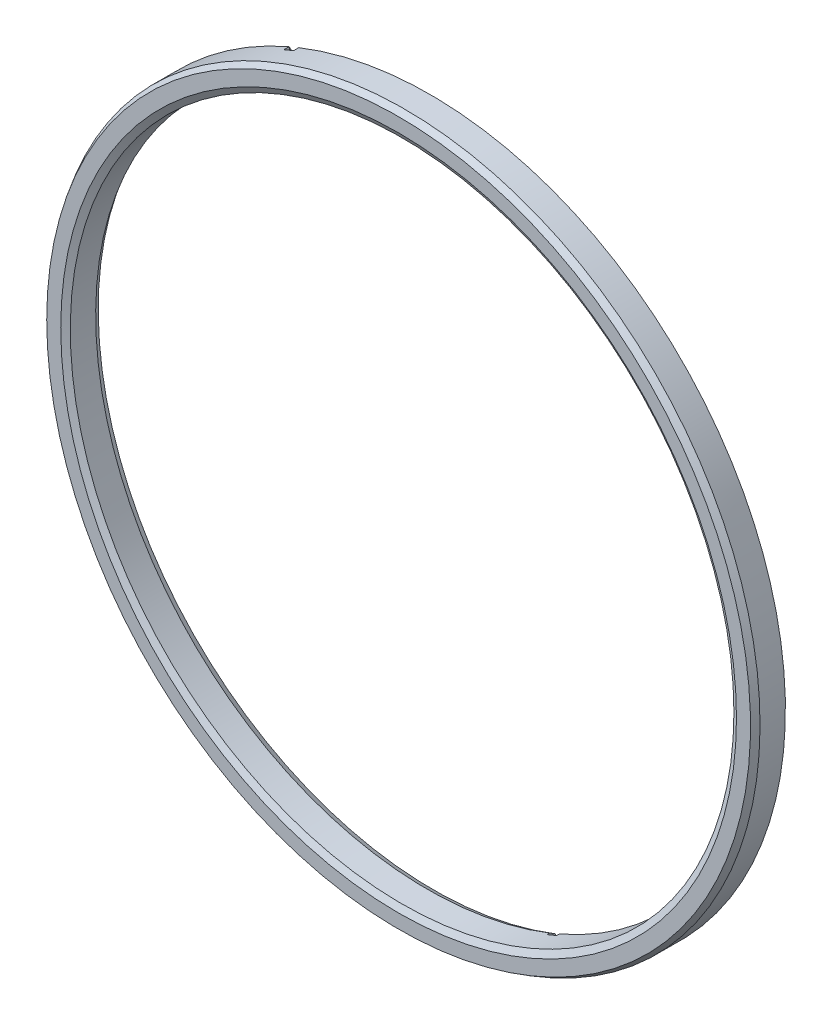
ISO-10303-21;
HEADER;
FILE_DESCRIPTION(('STEP AP214'),'2;1');
FILE_NAME('part.step','',(''),(''),'','','');
FILE_SCHEMA(('AUTOMOTIVE_DESIGN { 1 0 10303 214 1 1 1 1 }'));
ENDSEC;
DATA;
#1=APPLICATION_CONTEXT('core data for automotive mechanical design processes');
#2=APPLICATION_PROTOCOL_DEFINITION('international standard','automotive_design',2000,#1);
#3=PRODUCT_CONTEXT('',#1,'mechanical');
#4=PRODUCT('Part','Part','',(#3));
#5=PRODUCT_RELATED_PRODUCT_CATEGORY('part','',(#4));
#6=PRODUCT_DEFINITION_FORMATION('','',#4);
#7=PRODUCT_DEFINITION_CONTEXT('part definition',#1,'design');
#8=PRODUCT_DEFINITION('design','',#6,#7);
#9=PRODUCT_DEFINITION_SHAPE('','',#8);
#10=(LENGTH_UNIT() NAMED_UNIT(*) SI_UNIT(.MILLI.,.METRE.));
#11=(NAMED_UNIT(*) PLANE_ANGLE_UNIT() SI_UNIT($,.RADIAN.));
#12=(NAMED_UNIT(*) SI_UNIT($,.STERADIAN.) SOLID_ANGLE_UNIT());
#13=UNCERTAINTY_MEASURE_WITH_UNIT(LENGTH_MEASURE(1.E-05),#10,'distance_accuracy_value','');
#14=(GEOMETRIC_REPRESENTATION_CONTEXT(3) GLOBAL_UNCERTAINTY_ASSIGNED_CONTEXT((#13)) GLOBAL_UNIT_ASSIGNED_CONTEXT((#10,
#11,#12)) REPRESENTATION_CONTEXT('',''));
#15=CARTESIAN_POINT('',(0.,0.,0.));
#16=DIRECTION('',(0.,0.,1.));
#17=DIRECTION('',(1.,0.,0.));
#18=AXIS2_PLACEMENT_3D('',#15,#16,#17);
#19=CARTESIAN_POINT('',(25.5092935532047,63.8606630892754,18.8472107914945));
#20=DIRECTION('',(0.,0.,-1.));
#21=DIRECTION('',(-1.,0.,0.));
#22=AXIS2_PLACEMENT_3D('',#19,#20,#21);
#23=PLANE('',#22);
#24=CARTESIAN_POINT('',(35.7609440182283,40.1333159136432,18.8472107914945));
#25=DIRECTION('',(0.,0.,-1.));
#26=DIRECTION('',(-1.,0.,0.));
#27=AXIS2_PLACEMENT_3D('',#24,#25,#26);
#28=CIRCLE('',#27,25.8445);
#29=CARTESIAN_POINT('',(25.5103693487983,63.8580687932085,18.8472107914945));
#30=VERTEX_POINT('',#29);
#31=CARTESIAN_POINT('',(26.2142501010647,64.1499521373527,18.8472107914945));
#32=VERTEX_POINT('',#31);
#33=EDGE_CURVE('E379',#30,#32,#28,.T.);
#34=ORIENTED_EDGE('',*,*,#33,.T.);
#35=DIRECTION('',(-0.383049008063238,0.923728021347068,0.));
#36=VECTOR('',#35,1.);
#37=CARTESIAN_POINT('',(46.0125944832518,16.405968738011,18.8472107914945));
#38=LINE('',#37,#36);
#39=CARTESIAN_POINT('',(26.871064072711,62.566036090971,18.8472107914945));
#40=VERTEX_POINT('',#39);
#41=EDGE_CURVE('E172',#32,#40,#38,.F.);
#42=ORIENTED_EDGE('',*,*,#41,.T.);
#43=CARTESIAN_POINT('',(35.7609440182283,40.1333159136432,18.8472107914945));
#44=DIRECTION('',(0.,0.,-1.));
#45=DIRECTION('',(-1.,0.,0.));
#46=AXIS2_PLACEMENT_3D('',#43,#44,#45);
#47=CIRCLE('',#46,24.13);
#48=CARTESIAN_POINT('',(26.1671833204446,62.2741527468269,18.8472107914945));
#49=VERTEX_POINT('',#48);
#50=EDGE_CURVE('E19',#40,#49,#47,.F.);
#51=ORIENTED_EDGE('',*,*,#50,.T.);
#52=DIRECTION('',(0.383049008063238,-0.923728021347068,0.));
#53=VECTOR('',#52,1.);
#54=CARTESIAN_POINT('',(45.3087137309854,16.1140853938668,18.8472107914945));
#55=LINE('',#54,#53);
#56=EDGE_CURVE('E332',#49,#30,#55,.F.);
#57=ORIENTED_EDGE('',*,*,#56,.T.);
#58=EDGE_LOOP('',(#34,#42,#51,#57));
#59=FACE_BOUND('',#58,.T.);
#60=ADVANCED_FACE('F16',(#59),#23,.T.);
#61=CARTESIAN_POINT('',(25.5092935532047,63.8606630892754,18.8472107914945));
#62=DIRECTION('',(0.,0.,-1.));
#63=DIRECTION('',(-1.,0.,0.));
#64=AXIS2_PLACEMENT_3D('',#61,#62,#63);
#65=PLANE('',#64);
#66=CARTESIAN_POINT('',(35.7609440182283,40.1333159136432,18.8472107914945));
#67=DIRECTION('',(0.,0.,-1.));
#68=DIRECTION('',(-1.,0.,0.));
#69=AXIS2_PLACEMENT_3D('',#66,#67,#68);
#70=CIRCLE('',#69,25.8445);
#71=CARTESIAN_POINT('',(46.0115186876582,16.4085630340779,18.8472107914945));
#72=VERTEX_POINT('',#71);
#73=CARTESIAN_POINT('',(45.3076379353918,16.1166796899337,18.8472107914945));
#74=VERTEX_POINT('',#73);
#75=EDGE_CURVE('E176',#72,#74,#70,.T.);
#76=ORIENTED_EDGE('',*,*,#75,.T.);
#77=DIRECTION('',(0.383049008063238,-0.923728021347068,0.));
#78=VECTOR('',#77,1.);
#79=CARTESIAN_POINT('',(45.3087137309854,16.1140853938668,18.8472107914945));
#80=LINE('',#79,#78);
#81=CARTESIAN_POINT('',(44.6508239637455,17.7005957363154,18.8472107914945));
#82=VERTEX_POINT('',#81);
#83=EDGE_CURVE('E166',#74,#82,#80,.F.);
#84=ORIENTED_EDGE('',*,*,#83,.T.);
#85=CARTESIAN_POINT('',(35.7609440182283,40.1333159136432,18.8472107914945));
#86=DIRECTION('',(0.,0.,-1.));
#87=DIRECTION('',(-1.,0.,0.));
#88=AXIS2_PLACEMENT_3D('',#85,#86,#87);
#89=CIRCLE('',#88,24.13);
#90=CARTESIAN_POINT('',(45.3547047160119,17.9924790804596,18.8472107914945));
#91=VERTEX_POINT('',#90);
#92=EDGE_CURVE('E165',#82,#91,#89,.F.);
#93=ORIENTED_EDGE('',*,*,#92,.T.);
#94=DIRECTION('',(-0.383049008063238,0.923728021347068,0.));
#95=VECTOR('',#94,1.);
#96=CARTESIAN_POINT('',(46.0125944832518,16.405968738011,18.8472107914945));
#97=LINE('',#96,#95);
#98=EDGE_CURVE('E328',#91,#72,#97,.F.);
#99=ORIENTED_EDGE('',*,*,#98,.T.);
#100=EDGE_LOOP('',(#76,#84,#93,#99));
#101=FACE_BOUND('',#100,.T.);
#102=ADVANCED_FACE('F255',(#101),#65,.T.);
#103=CARTESIAN_POINT('',(46.0125944832518,16.405968738011,18.8472107914945));
#104=DIRECTION('',(0.923728021347068,0.383049008063238,0.));
#105=DIRECTION('',(-0.383049008063238,0.923728021347068,0.));
#106=AXIS2_PLACEMENT_3D('',#103,#104,#105);
#107=PLANE('',#106);
#108=DIRECTION('',(0.383049008064121,-0.923728021346702,-1.65182369101738E-12));
#109=VECTOR('',#108,1.);
#110=CARTESIAN_POINT('',(26.2142501010647,64.1499521373527,18.476175334568));
#111=LINE('',#110,#109);
#112=CARTESIAN_POINT('',(26.2142501010647,64.1499521373527,18.476175334568));
#113=VERTEX_POINT('',#112);
#114=CARTESIAN_POINT('',(26.8321414617719,62.6598985101098,18.4761753342959));
#115=VERTEX_POINT('',#114);
#116=EDGE_CURVE('E229',#113,#115,#111,.T.);
#117=ORIENTED_EDGE('',*,*,#116,.T.);
#118=DIRECTION('',(-0.19154233713003,0.461907015438891,-0.865998523194527));
#119=VECTOR('',#118,1.);
#120=CARTESIAN_POINT('',(26.871064072711,62.566036090971,18.6521516966171));
#121=LINE('',#120,#119);
#122=CARTESIAN_POINT('',(26.871064072711,62.566036090971,18.6521516966171));
#123=VERTEX_POINT('',#122);
#124=EDGE_CURVE('E99',#123,#115,#121,.T.);
#125=ORIENTED_EDGE('',*,*,#124,.F.);
#126=DIRECTION('',(0.,0.,1.));
#127=VECTOR('',#126,1.);
#128=CARTESIAN_POINT('',(26.871064072711,62.566036090971,18.8472107914945));
#129=LINE('',#128,#127);
#130=EDGE_CURVE('E175',#40,#123,#129,.F.);
#131=ORIENTED_EDGE('',*,*,#130,.F.);
#132=ORIENTED_EDGE('',*,*,#41,.F.);
#133=DIRECTION('',(0.,0.,1.));
#134=VECTOR('',#133,1.);
#135=CARTESIAN_POINT('',(26.2142501010647,64.1499521373527,18.8472107914945));
#136=LINE('',#135,#134);
#137=EDGE_CURVE('E168',#113,#32,#136,.T.);
#138=ORIENTED_EDGE('',*,*,#137,.F.);
#139=EDGE_LOOP('',(#117,#125,#131,#132,#138));
#140=FACE_BOUND('',#139,.T.);
#141=ADVANCED_FACE('F253',(#140),#107,.F.);
#142=CARTESIAN_POINT('',(45.3087137309854,16.1140853938668,18.8472107914945));
#143=DIRECTION('',(-0.923728021347068,-0.383049008063238,0.));
#144=DIRECTION('',(0.383049008063238,-0.923728021347068,0.));
#145=AXIS2_PLACEMENT_3D('',#142,#143,#144);
#146=PLANE('',#145);
#147=DIRECTION('',(-0.383049008064119,0.923728021346703,-1.65182369101736E-12));
#148=VECTOR('',#147,1.);
#149=CARTESIAN_POINT('',(45.3076379353918,16.1166796899337,18.476175334568));
#150=LINE('',#149,#148);
#151=CARTESIAN_POINT('',(45.3076379353918,16.1166796899337,18.476175334568));
#152=VERTEX_POINT('',#151);
#153=CARTESIAN_POINT('',(44.6897465746846,17.6067333171766,18.476175334296));
#154=VERTEX_POINT('',#153);
#155=EDGE_CURVE('E158',#152,#154,#150,.T.);
#156=ORIENTED_EDGE('',*,*,#155,.T.);
#157=DIRECTION('',(0.191542337130016,-0.461907015438865,-0.865998523194544));
#158=VECTOR('',#157,1.);
#159=CARTESIAN_POINT('',(44.6508239637455,17.7005957363154,18.6521516966171));
#160=LINE('',#159,#158);
#161=CARTESIAN_POINT('',(44.6508239637455,17.7005957363154,18.6521516966171));
#162=VERTEX_POINT('',#161);
#163=EDGE_CURVE('E144',#162,#154,#160,.T.);
#164=ORIENTED_EDGE('',*,*,#163,.F.);
#165=DIRECTION('',(0.,0.,1.));
#166=VECTOR('',#165,1.);
#167=CARTESIAN_POINT('',(44.6508239637455,17.7005957363154,18.8472107914945));
#168=LINE('',#167,#166);
#169=EDGE_CURVE('E155',#82,#162,#168,.F.);
#170=ORIENTED_EDGE('',*,*,#169,.F.);
#171=ORIENTED_EDGE('',*,*,#83,.F.);
#172=DIRECTION('',(0.,0.,1.));
#173=VECTOR('',#172,1.);
#174=CARTESIAN_POINT('',(45.3076379353918,16.1166796899337,18.8472107914945));
#175=LINE('',#174,#173);
#176=EDGE_CURVE('E159',#152,#74,#175,.T.);
#177=ORIENTED_EDGE('',*,*,#176,.F.);
#178=EDGE_LOOP('',(#156,#164,#170,#171,#177));
#179=FACE_BOUND('',#178,.T.);
#180=ADVANCED_FACE('F153',(#179),#146,.F.);
#181=CARTESIAN_POINT('',(45.3087137309854,16.1140853938668,18.8472107914945));
#182=DIRECTION('',(-0.923728021347068,-0.383049008063238,0.));
#183=DIRECTION('',(0.383049008063238,-0.923728021347068,0.));
#184=AXIS2_PLACEMENT_3D('',#181,#182,#183);
#185=PLANE('',#184);
#186=DIRECTION('',(-0.383049008063237,0.923728021347069,0.));
#187=VECTOR('',#186,1.);
#188=CARTESIAN_POINT('',(26.1282607094196,62.3680151657626,18.476175334568));
#189=LINE('',#188,#187);
#190=CARTESIAN_POINT('',(26.1282607094196,62.3680151657626,18.476175334568));
#191=VERTEX_POINT('',#190);
#192=CARTESIAN_POINT('',(25.5103693487983,63.8580687932085,18.476175334568));
#193=VERTEX_POINT('',#192);
#194=EDGE_CURVE('E302',#191,#193,#189,.T.);
#195=ORIENTED_EDGE('',*,*,#194,.T.);
#196=DIRECTION('',(0.,0.,1.));
#197=VECTOR('',#196,1.);
#198=CARTESIAN_POINT('',(25.5103693487983,63.8580687932085,18.8472107914945));
#199=LINE('',#198,#197);
#200=EDGE_CURVE('E129',#30,#193,#199,.F.);
#201=ORIENTED_EDGE('',*,*,#200,.F.);
#202=ORIENTED_EDGE('',*,*,#56,.F.);
#203=DIRECTION('',(0.,0.,1.));
#204=VECTOR('',#203,1.);
#205=CARTESIAN_POINT('',(26.1671833204446,62.2741527468269,18.8472107914945));
#206=LINE('',#205,#204);
#207=CARTESIAN_POINT('',(26.1671833204446,62.2741527468269,18.6521516966171));
#208=VERTEX_POINT('',#207);
#209=EDGE_CURVE('E317',#208,#49,#206,.T.);
#210=ORIENTED_EDGE('',*,*,#209,.F.);
#211=DIRECTION('',(0.191542337130011,-0.461907015438841,0.865998523194558));
#212=VECTOR('',#211,1.);
#213=CARTESIAN_POINT('',(26.1282607094196,62.3680151657626,18.476175334568));
#214=LINE('',#213,#212);
#215=EDGE_CURVE('E122',#191,#208,#214,.T.);
#216=ORIENTED_EDGE('',*,*,#215,.F.);
#217=EDGE_LOOP('',(#195,#201,#202,#210,#216));
#218=FACE_BOUND('',#217,.T.);
#219=ADVANCED_FACE('F247',(#218),#185,.F.);
#220=CARTESIAN_POINT('',(46.0125944832518,16.405968738011,18.8472107914945));
#221=DIRECTION('',(0.923728021347068,0.383049008063238,0.));
#222=DIRECTION('',(-0.383049008063238,0.923728021347068,0.));
#223=AXIS2_PLACEMENT_3D('',#220,#221,#222);
#224=PLANE('',#223);
#225=DIRECTION('',(0.383049008063236,-0.923728021347069,0.));
#226=VECTOR('',#225,1.);
#227=CARTESIAN_POINT('',(45.3936273270369,17.8986166615238,18.476175334568));
#228=LINE('',#227,#226);
#229=CARTESIAN_POINT('',(45.3936273270369,17.8986166615238,18.476175334568));
#230=VERTEX_POINT('',#229);
#231=CARTESIAN_POINT('',(46.0115186876582,16.4085630340779,18.476175334568));
#232=VERTEX_POINT('',#231);
#233=EDGE_CURVE('E347',#230,#232,#228,.T.);
#234=ORIENTED_EDGE('',*,*,#233,.T.);
#235=DIRECTION('',(0.,0.,1.));
#236=VECTOR('',#235,1.);
#237=CARTESIAN_POINT('',(46.0115186876582,16.4085630340779,18.8472107914945));
#238=LINE('',#237,#236);
#239=EDGE_CURVE('E331',#72,#232,#238,.F.);
#240=ORIENTED_EDGE('',*,*,#239,.F.);
#241=ORIENTED_EDGE('',*,*,#98,.F.);
#242=DIRECTION('',(0.,0.,1.));
#243=VECTOR('',#242,1.);
#244=CARTESIAN_POINT('',(45.3547047160119,17.9924790804596,18.8472107914945));
#245=LINE('',#244,#243);
#246=CARTESIAN_POINT('',(45.3547047160119,17.9924790804596,18.6521516966171));
#247=VERTEX_POINT('',#246);
#248=EDGE_CURVE('E326',#247,#91,#245,.T.);
#249=ORIENTED_EDGE('',*,*,#248,.F.);
#250=DIRECTION('',(-0.191542337130026,0.461907015438853,0.865998523194548));
#251=VECTOR('',#250,1.);
#252=CARTESIAN_POINT('',(45.3936273270369,17.8986166615238,18.476175334568));
#253=LINE('',#252,#251);
#254=EDGE_CURVE('E321',#230,#247,#253,.T.);
#255=ORIENTED_EDGE('',*,*,#254,.F.);
#256=EDGE_LOOP('',(#234,#240,#241,#249,#255));
#257=FACE_BOUND('',#256,.T.);
#258=ADVANCED_FACE('F241',(#257),#224,.F.);
#259=CARTESIAN_POINT('',(46.0125944832518,16.405968738011,18.476175334568));
#260=DIRECTION('',(0.799971932674088,0.331730171877191,0.500000000000013));
#261=DIRECTION('',(0.530012311648119,0.,-0.847989946580392));
#262=AXIS2_PLACEMENT_3D('',#259,#260,#261);
#263=PLANE('',#262);
#264=DIRECTION('',(0.383049008063236,-0.923728021347069,0.));
#265=VECTOR('',#264,1.);
#266=CARTESIAN_POINT('',(26.5246145772638,63.7993641951603,18.2122107914945));
#267=LINE('',#266,#265);
#268=CARTESIAN_POINT('',(26.5246145772638,63.7993641951603,18.2122107914945));
#269=VERTEX_POINT('',#268);
#270=CARTESIAN_POINT('',(26.9156285314569,62.8564285952166,18.2122107914945));
#271=VERTEX_POINT('',#270);
#272=EDGE_CURVE('E354',#269,#271,#267,.T.);
#273=ORIENTED_EDGE('',*,*,#272,.T.);
#274=CARTESIAN_POINT('',(26.8321414618578,62.6598985103128,18.4761753340239));
#275=CARTESIAN_POINT('',(26.8460182861284,62.6927048155727,18.4322075115966));
#276=CARTESIAN_POINT('',(26.8599139540717,62.7254854752969,18.3882265551466));
#277=CARTESIAN_POINT('',(26.8877429772715,62.7909955035981,18.3002383743034));
#278=CARTESIAN_POINT('',(26.9016763325279,62.8237248721751,18.2562311499103));
#279=CARTESIAN_POINT('',(26.9156285314569,62.8564285952166,18.2122107914945));
#280=B_SPLINE_CURVE_WITH_KNOTS('',3,(#274,#275,#276,#277,#278,#279),.UNSPECIFIED.,.F.,.F.,(4,2,
4),(0.,0.169758274991892,0.339516549589812),.UNSPECIFIED.);
#281=EDGE_CURVE('E221',#115,#271,#280,.T.);
#282=ORIENTED_EDGE('',*,*,#281,.F.);
#283=ORIENTED_EDGE('',*,*,#116,.F.);
#284=DIRECTION('',(-0.464696280589968,-0.184658441688331,0.866001516580131));
#285=VECTOR('',#284,1.);
#286=CARTESIAN_POINT('',(26.2195970733453,64.1520768876688,18.4662107914945));
#287=LINE('',#286,#285);
#288=CARTESIAN_POINT('',(26.2195970733453,64.1520768876687,18.4662107914945));
#289=VERTEX_POINT('',#288);
#290=EDGE_CURVE('E318',#289,#113,#287,.T.);
#291=ORIENTED_EDGE('',*,*,#290,.F.);
#292=CARTESIAN_POINT('',(26.5246145772637,63.7993641951603,18.2122107914945));
#293=CARTESIAN_POINT('',(26.4737857719563,63.858178399862,18.2545131342601));
#294=CARTESIAN_POINT('',(26.4229532439632,63.9169782266034,18.2968309723203));
#295=CARTESIAN_POINT('',(26.321280742657,64.0345491241062,18.381497638987));
#296=CARTESIAN_POINT('',(26.2704407693439,64.0933201948676,18.4238464675935));
#297=CARTESIAN_POINT('',(26.2195970733453,64.1520768876687,18.4662107914945));
#298=B_SPLINE_CURVE_WITH_KNOTS('',3,(#292,#293,#294,#295,#296,#297),.UNSPECIFIED.,.F.,.F.,(4,2,
4),(0.,0.265498558387212,0.530997116506294),.UNSPECIFIED.);
#299=EDGE_CURVE('E228',#269,#289,#298,.T.);
#300=ORIENTED_EDGE('',*,*,#299,.F.);
#301=EDGE_LOOP('',(#273,#282,#283,#291,#300));
#302=FACE_BOUND('',#301,.T.);
#303=ADVANCED_FACE('F235',(#302),#263,.F.);
#304=CARTESIAN_POINT('',(45.3087137309854,16.1140853938668,18.476175334568));
#305=DIRECTION('',(-0.799971932674088,-0.331730171877191,0.500000000000013));
#306=DIRECTION('',(0.530012311648119,0.,0.847989946580392));
#307=AXIS2_PLACEMENT_3D('',#304,#305,#306);
#308=PLANE('',#307);
#309=DIRECTION('',(-0.383049008063239,0.923728021347068,0.));
#310=VECTOR('',#309,1.);
#311=CARTESIAN_POINT('',(44.9972734591928,16.4672676321261,18.2122107914945));
#312=LINE('',#311,#310);
#313=CARTESIAN_POINT('',(44.9972734591928,16.4672676321261,18.2122107914945));
#314=VERTEX_POINT('',#313);
#315=CARTESIAN_POINT('',(44.6062595049996,17.4102032320698,18.2122107914945));
#316=VERTEX_POINT('',#315);
#317=EDGE_CURVE('E357',#314,#316,#312,.T.);
#318=ORIENTED_EDGE('',*,*,#317,.T.);
#319=CARTESIAN_POINT('',(44.6897465745987,17.6067333169736,18.4761753340239));
#320=CARTESIAN_POINT('',(44.6758697503281,17.5739270117137,18.4322075115966));
#321=CARTESIAN_POINT('',(44.6619740823848,17.5411463519895,18.3882265551466));
#322=CARTESIAN_POINT('',(44.634145059185,17.4756363236883,18.3002383743034));
#323=CARTESIAN_POINT('',(44.6202117039286,17.4429069551113,18.2562311499103));
#324=CARTESIAN_POINT('',(44.6062595049996,17.4102032320698,18.2122107914945));
#325=B_SPLINE_CURVE_WITH_KNOTS('',3,(#319,#320,#321,#322,#323,#324),.UNSPECIFIED.,.F.,.F.,(4,2,
4),(0.,0.169758274991902,0.339516549589817),.UNSPECIFIED.);
#326=EDGE_CURVE('E303',#154,#316,#325,.T.);
#327=ORIENTED_EDGE('',*,*,#326,.F.);
#328=ORIENTED_EDGE('',*,*,#155,.F.);
#329=DIRECTION('',(0.464696280590487,0.184658441686728,0.866001516580194));
#330=VECTOR('',#329,1.);
#331=CARTESIAN_POINT('',(45.3022909631112,16.1145549396177,18.4662107914945));
#332=LINE('',#331,#330);
#333=CARTESIAN_POINT('',(45.3022909631112,16.1145549396177,18.4662107914945));
#334=VERTEX_POINT('',#333);
#335=EDGE_CURVE('E309',#334,#152,#332,.T.);
#336=ORIENTED_EDGE('',*,*,#335,.F.);
#337=CARTESIAN_POINT('',(44.9972734591927,16.4672676321261,18.2122107914945));
#338=CARTESIAN_POINT('',(45.0481022645002,16.4084534274244,18.2545131342601));
#339=CARTESIAN_POINT('',(45.0989347924933,16.349653600683,18.2968309723203));
#340=CARTESIAN_POINT('',(45.2006072937995,16.2320827031802,18.381497638987));
#341=CARTESIAN_POINT('',(45.2514472671126,16.1733116324188,18.4238464675935));
#342=CARTESIAN_POINT('',(45.3022909631112,16.1145549396177,18.4662107914945));
#343=B_SPLINE_CURVE_WITH_KNOTS('',3,(#337,#338,#339,#340,#341,#342),.UNSPECIFIED.,.F.,.F.,(4,2,
4),(0.,0.265498558387214,0.530997116506312),.UNSPECIFIED.);
#344=EDGE_CURVE('E297',#314,#334,#343,.T.);
#345=ORIENTED_EDGE('',*,*,#344,.F.);
#346=EDGE_LOOP('',(#318,#327,#328,#336,#345));
#347=FACE_BOUND('',#346,.T.);
#348=ADVANCED_FACE('F240',(#347),#308,.F.);
#349=CARTESIAN_POINT('',(45.3087137309854,16.1140853938668,18.476175334568));
#350=DIRECTION('',(-0.799971932674088,-0.331730171877191,0.500000000000013));
#351=DIRECTION('',(0.530012311648119,0.,0.847989946580392));
#352=AXIS2_PLACEMENT_3D('',#349,#350,#351);
#353=PLANE('',#352);
#354=DIRECTION('',(-0.383049008063236,0.923728021347069,0.));
#355=VECTOR('',#354,1.);
#356=CARTESIAN_POINT('',(25.9301954782838,62.4477919134148,18.2122107914945));
#357=LINE('',#356,#355);
#358=CARTESIAN_POINT('',(25.9301954782838,62.4477919134148,18.2122107914945));
#359=VERTEX_POINT('',#358);
#360=CARTESIAN_POINT('',(25.5391815240907,63.3907275133584,18.2122107914945));
#361=VERTEX_POINT('',#360);
#362=EDGE_CURVE('E200',#359,#361,#357,.T.);
#363=ORIENTED_EDGE('',*,*,#362,.T.);
#364=CARTESIAN_POINT('',(25.5050878480378,63.8557861574093,18.4662107914945));
#365=CARTESIAN_POINT('',(25.5107445172798,63.7782914320093,18.4238464675935));
#366=CARTESIAN_POINT('',(25.5164139915704,63.7007891823247,18.381497638987));
#367=CARTESIAN_POINT('',(25.5277785502547,63.5457696343077,18.2968309723203));
#368=CARTESIAN_POINT('',(25.5334736346484,63.4682523359754,18.2545131342601));
#369=CARTESIAN_POINT('',(25.5391815240907,63.3907275133584,18.2122107914945));
#370=B_SPLINE_CURVE_WITH_KNOTS('',3,(#364,#365,#366,#367,#368,#369),.UNSPECIFIED.,.F.,.F.,(4,2,
4),(0.,0.265498558119098,0.530997116506315),.UNSPECIFIED.);
#371=CARTESIAN_POINT('',(25.5050878480378,63.8557861574093,18.4662107914945));
#372=VERTEX_POINT('',#371);
#373=EDGE_CURVE('E34',#372,#361,#370,.T.);
#374=ORIENTED_EDGE('',*,*,#373,.F.);
#375=DIRECTION('',(-0.459006261965843,-0.19838000090036,-0.866001516580033));
#376=VECTOR('',#375,1.);
#377=CARTESIAN_POINT('',(25.5103693487983,63.8580687932085,18.476175334568));
#378=LINE('',#377,#376);
#379=EDGE_CURVE('E337',#193,#372,#378,.T.);
#380=ORIENTED_EDGE('',*,*,#379,.F.);
#381=ORIENTED_EDGE('',*,*,#194,.F.);
#382=CARTESIAN_POINT('',(25.9301954782838,62.4477919134148,18.2122107914945));
#383=CARTESIAN_POINT('',(25.9631966823432,62.4345586979004,18.2562311517643));
#384=CARTESIAN_POINT('',(25.9962027209431,62.421294027579,18.3002383780104));
#385=CARTESIAN_POINT('',(26.0622244673002,62.3947017772916,18.3882265625572));
#386=CARTESIAN_POINT('',(26.0952401750576,62.3813741973254,18.4322075208579));
#387=CARTESIAN_POINT('',(26.1282607173554,62.368015162552,18.4761753451348));
#388=B_SPLINE_CURVE_WITH_KNOTS('',3,(#382,#383,#384,#385,#386,#387),.UNSPECIFIED.,.F.,.F.,(4,2,
4),(0.,0.169758281747717,0.339516563889414),.UNSPECIFIED.);
#389=EDGE_CURVE('E350',#359,#191,#388,.T.);
#390=ORIENTED_EDGE('',*,*,#389,.F.);
#391=EDGE_LOOP('',(#363,#374,#380,#381,#390));
#392=FACE_BOUND('',#391,.T.);
#393=ADVANCED_FACE('F377',(#392),#353,.F.);
#394=CARTESIAN_POINT('',(46.0125944832518,16.405968738011,18.476175334568));
#395=DIRECTION('',(0.799971932674088,0.331730171877191,0.500000000000013));
#396=DIRECTION('',(0.530012311648119,0.,-0.847989946580392));
#397=AXIS2_PLACEMENT_3D('',#394,#395,#396);
#398=PLANE('',#397);
#399=DIRECTION('',(0.383049008063234,-0.92372802134707,0.));
#400=VECTOR('',#399,1.);
#401=CARTESIAN_POINT('',(45.5916925581727,17.8188399138716,18.2122107914945));
#402=LINE('',#401,#400);
#403=CARTESIAN_POINT('',(45.5916925581727,17.8188399138716,18.2122107914945));
#404=VERTEX_POINT('',#403);
#405=CARTESIAN_POINT('',(45.9827065123658,16.875904313928,18.2122107914945));
#406=VERTEX_POINT('',#405);
#407=EDGE_CURVE('E351',#404,#406,#402,.T.);
#408=ORIENTED_EDGE('',*,*,#407,.T.);
#409=CARTESIAN_POINT('',(46.0168001884187,16.4108456698771,18.4662107914945));
#410=CARTESIAN_POINT('',(46.0111435191767,16.4883403952771,18.4238464675935));
#411=CARTESIAN_POINT('',(46.0054740448861,16.5658426449618,18.381497638987));
#412=CARTESIAN_POINT('',(45.9941094862018,16.7208621929787,18.2968309723203));
#413=CARTESIAN_POINT('',(45.9884144018081,16.798379491311,18.2545131342601));
#414=CARTESIAN_POINT('',(45.9827065123658,16.875904313928,18.2122107914945));
#415=B_SPLINE_CURVE_WITH_KNOTS('',3,(#409,#410,#411,#412,#413,#414),.UNSPECIFIED.,.F.,.F.,(4,2,
4),(0.,0.265498558119098,0.530997116506313),.UNSPECIFIED.);
#416=CARTESIAN_POINT('',(46.0168001884187,16.4108456698771,18.4662107914945));
#417=VERTEX_POINT('',#416);
#418=EDGE_CURVE('E201',#417,#406,#415,.T.);
#419=ORIENTED_EDGE('',*,*,#418,.F.);
#420=DIRECTION('',(0.459006261966054,0.198380000900622,-0.866001516579861));
#421=VECTOR('',#420,1.);
#422=CARTESIAN_POINT('',(46.0115186876582,16.4085630340779,18.476175334568));
#423=LINE('',#422,#421);
#424=EDGE_CURVE('E344',#232,#417,#423,.T.);
#425=ORIENTED_EDGE('',*,*,#424,.F.);
#426=ORIENTED_EDGE('',*,*,#233,.F.);
#427=CARTESIAN_POINT('',(45.3936273191011,17.8986166647344,18.4761753451348));
#428=CARTESIAN_POINT('',(45.4266478613989,17.8852576299611,18.4322075208579));
#429=CARTESIAN_POINT('',(45.4596635691563,17.8719300499948,18.3882265625572));
#430=CARTESIAN_POINT('',(45.5256853155134,17.8453377997074,18.3002383780104));
#431=CARTESIAN_POINT('',(45.5586913541133,17.832073129386,18.2562311517643));
#432=CARTESIAN_POINT('',(45.5916925581727,17.8188399138716,18.2122107914945));
#433=B_SPLINE_CURVE_WITH_KNOTS('',3,(#427,#428,#429,#430,#431,#432),.UNSPECIFIED.,.F.,.F.,(4,2,
4),(0.,0.169758282141694,0.339516563889413),.UNSPECIFIED.);
#434=EDGE_CURVE('E192',#230,#404,#433,.T.);
#435=ORIENTED_EDGE('',*,*,#434,.T.);
#436=EDGE_LOOP('',(#408,#419,#425,#426,#435));
#437=FACE_BOUND('',#436,.T.);
#438=ADVANCED_FACE('F207',(#437),#398,.F.);
#439=CARTESIAN_POINT('',(45.6606541071186,16.2600270659389,18.2122107914945));
#440=DIRECTION('',(0.,0.,1.));
#441=DIRECTION('',(1.,0.,0.));
#442=AXIS2_PLACEMENT_3D('',#439,#440,#441);
#443=PLANE('',#442);
#444=CARTESIAN_POINT('',(35.7609440182283,40.1333159136432,18.2122107914945));
#445=DIRECTION('',(0.,0.,-1.));
#446=DIRECTION('',(-1.,0.,0.));
#447=AXIS2_PLACEMENT_3D('',#444,#445,#446);
#448=CIRCLE('',#447,24.384);
#449=EDGE_CURVE('E189',#404,#271,#448,.F.);
#450=ORIENTED_EDGE('',*,*,#449,.T.);
#451=ORIENTED_EDGE('',*,*,#272,.F.);
#452=CARTESIAN_POINT('',(35.7609440182283,40.1333159136432,18.2122107914945));
#453=DIRECTION('',(0.,0.,1.));
#454=DIRECTION('',(1.,0.,0.));
#455=AXIS2_PLACEMENT_3D('',#452,#453,#454);
#456=CIRCLE('',#455,25.4045590948775);
#457=EDGE_CURVE('E183',#406,#269,#456,.T.);
#458=ORIENTED_EDGE('',*,*,#457,.F.);
#459=ORIENTED_EDGE('',*,*,#407,.F.);
#460=EDGE_LOOP('',(#450,#451,#458,#459));
#461=FACE_BOUND('',#460,.T.);
#462=ADVANCED_FACE('F398',(#461),#443,.F.);
#463=CARTESIAN_POINT('',(45.6606541071186,16.2600270659389,18.2122107914945));
#464=DIRECTION('',(0.,0.,1.));
#465=DIRECTION('',(1.,0.,0.));
#466=AXIS2_PLACEMENT_3D('',#463,#464,#465);
#467=PLANE('',#466);
#468=CARTESIAN_POINT('',(35.7609440182283,40.1333159136432,18.2122107914945));
#469=DIRECTION('',(0.,0.,1.));
#470=DIRECTION('',(1.,0.,0.));
#471=AXIS2_PLACEMENT_3D('',#468,#469,#470);
#472=CIRCLE('',#471,25.4045590948775);
#473=EDGE_CURVE('E181',#361,#314,#472,.T.);
#474=ORIENTED_EDGE('',*,*,#473,.F.);
#475=ORIENTED_EDGE('',*,*,#362,.F.);
#476=CARTESIAN_POINT('',(35.7609440182283,40.1333159136432,18.2122107914945));
#477=DIRECTION('',(0.,0.,-1.));
#478=DIRECTION('',(-1.,0.,0.));
#479=AXIS2_PLACEMENT_3D('',#476,#477,#478);
#480=CIRCLE('',#479,24.384);
#481=EDGE_CURVE('E186',#359,#316,#480,.F.);
#482=ORIENTED_EDGE('',*,*,#481,.T.);
#483=ORIENTED_EDGE('',*,*,#317,.F.);
#484=EDGE_LOOP('',(#474,#475,#482,#483));
#485=FACE_BOUND('',#484,.T.);
#486=ADVANCED_FACE('F216',(#485),#467,.F.);
#487=CARTESIAN_POINT('',(35.7609440182283,40.1333159136432,18.2122107914945));
#488=DIRECTION('',(0.,0.,-1.));
#489=DIRECTION('',(-1.,0.,0.));
#490=AXIS2_PLACEMENT_3D('',#487,#488,#489);
#491=CONICAL_SURFACE('',#490,24.384,0.523598775598307);
#492=CARTESIAN_POINT('',(35.7609440182283,40.1333159136432,18.6521516966171));
#493=DIRECTION('',(0.,0.,-1.));
#494=DIRECTION('',(-1.,0.,0.));
#495=AXIS2_PLACEMENT_3D('',#492,#493,#494);
#496=CIRCLE('',#495,24.13);
#497=EDGE_CURVE('E148',#247,#123,#496,.F.);
#498=ORIENTED_EDGE('',*,*,#497,.T.);
#499=ORIENTED_EDGE('',*,*,#124,.T.);
#500=ORIENTED_EDGE('',*,*,#281,.T.);
#501=ORIENTED_EDGE('',*,*,#449,.F.);
#502=ORIENTED_EDGE('',*,*,#434,.F.);
#503=ORIENTED_EDGE('',*,*,#254,.T.);
#504=EDGE_LOOP('',(#498,#499,#500,#501,#502,#503));
#505=FACE_BOUND('',#504,.T.);
#506=ADVANCED_FACE('F211',(#505),#491,.F.);
#507=CARTESIAN_POINT('',(35.7609440182283,40.1333159136432,18.2122107914945));
#508=DIRECTION('',(0.,0.,-1.));
#509=DIRECTION('',(-1.,0.,0.));
#510=AXIS2_PLACEMENT_3D('',#507,#508,#509);
#511=CONICAL_SURFACE('',#510,24.384,0.523598775598307);
#512=ORIENTED_EDGE('',*,*,#389,.T.);
#513=ORIENTED_EDGE('',*,*,#215,.T.);
#514=CARTESIAN_POINT('',(35.7609440182283,40.1333159136432,18.6521516966171));
#515=DIRECTION('',(0.,0.,-1.));
#516=DIRECTION('',(-1.,0.,0.));
#517=AXIS2_PLACEMENT_3D('',#514,#515,#516);
#518=CIRCLE('',#517,24.13);
#519=EDGE_CURVE('E140',#208,#162,#518,.F.);
#520=ORIENTED_EDGE('',*,*,#519,.T.);
#521=ORIENTED_EDGE('',*,*,#163,.T.);
#522=ORIENTED_EDGE('',*,*,#326,.T.);
#523=ORIENTED_EDGE('',*,*,#481,.F.);
#524=EDGE_LOOP('',(#512,#513,#520,#521,#522,#523));
#525=FACE_BOUND('',#524,.T.);
#526=ADVANCED_FACE('F143',(#525),#511,.F.);
#527=CARTESIAN_POINT('',(35.7609440182283,40.1333159136432,18.4662107914945));
#528=DIRECTION('',(0.,0.,1.));
#529=DIRECTION('',(1.,0.,0.));
#530=AXIS2_PLACEMENT_3D('',#527,#528,#529);
#531=CONICAL_SURFACE('',#530,25.8445,1.04719755119659);
#532=CARTESIAN_POINT('',(35.7609440182283,40.1333159136432,18.4662107914945));
#533=DIRECTION('',(0.,0.,-1.));
#534=DIRECTION('',(-1.,0.,0.));
#535=AXIS2_PLACEMENT_3D('',#532,#533,#534);
#536=CIRCLE('',#535,25.8445);
#537=EDGE_CURVE('E147',#417,#289,#536,.F.);
#538=ORIENTED_EDGE('',*,*,#537,.F.);
#539=ORIENTED_EDGE('',*,*,#418,.T.);
#540=ORIENTED_EDGE('',*,*,#457,.T.);
#541=ORIENTED_EDGE('',*,*,#299,.T.);
#542=EDGE_LOOP('',(#538,#539,#540,#541));
#543=FACE_BOUND('',#542,.T.);
#544=ADVANCED_FACE('F289',(#543),#531,.T.);
#545=CARTESIAN_POINT('',(35.7609440182283,40.1333159136432,18.4662107914945));
#546=DIRECTION('',(0.,0.,1.));
#547=DIRECTION('',(1.,0.,0.));
#548=AXIS2_PLACEMENT_3D('',#545,#546,#547);
#549=CONICAL_SURFACE('',#548,25.8445,1.04719755119659);
#550=CARTESIAN_POINT('',(35.7609440182283,40.1333159136432,18.4662107914945));
#551=DIRECTION('',(0.,0.,-1.));
#552=DIRECTION('',(-1.,0.,0.));
#553=AXIS2_PLACEMENT_3D('',#550,#551,#552);
#554=CIRCLE('',#553,25.8445);
#555=EDGE_CURVE('E363',#372,#334,#554,.F.);
#556=ORIENTED_EDGE('',*,*,#555,.F.);
#557=ORIENTED_EDGE('',*,*,#373,.T.);
#558=ORIENTED_EDGE('',*,*,#473,.T.);
#559=ORIENTED_EDGE('',*,*,#344,.T.);
#560=EDGE_LOOP('',(#556,#557,#558,#559));
#561=FACE_BOUND('',#560,.T.);
#562=ADVANCED_FACE('F286',(#561),#549,.T.);
#563=CARTESIAN_POINT('',(35.7609440182283,40.1333159136432,18.2122107914945));
#564=DIRECTION('',(0.,0.,-1.));
#565=DIRECTION('',(-1.,0.,0.));
#566=AXIS2_PLACEMENT_3D('',#563,#564,#565);
#567=CYLINDRICAL_SURFACE('',#566,24.13);
#568=ORIENTED_EDGE('',*,*,#497,.F.);
#569=ORIENTED_EDGE('',*,*,#248,.T.);
#570=ORIENTED_EDGE('',*,*,#92,.F.);
#571=ORIENTED_EDGE('',*,*,#169,.T.);
#572=ORIENTED_EDGE('',*,*,#519,.F.);
#573=ORIENTED_EDGE('',*,*,#209,.T.);
#574=ORIENTED_EDGE('',*,*,#50,.F.);
#575=ORIENTED_EDGE('',*,*,#130,.T.);
#576=EDGE_LOOP('',(#568,#569,#570,#571,#572,#573,#574,#575));
#577=FACE_BOUND('',#576,.T.);
#578=CARTESIAN_POINT('',(35.7609440182283,40.1333159136432,20.4982107914945));
#579=DIRECTION('',(0.,0.,1.));
#580=DIRECTION('',(-0.923728021347068,-0.383049008063238,0.));
#581=AXIS2_PLACEMENT_3D('',#578,#579,#580);
#582=CIRCLE('',#581,24.13);
#583=CARTESIAN_POINT('',(13.4713868631235,30.8903433490773,20.4982107914945));
#584=VERTEX_POINT('',#583);
#585=EDGE_CURVE('E365',#584,#584,#582,.T.);
#586=ORIENTED_EDGE('',*,*,#585,.T.);
#587=EDGE_LOOP('',(#586));
#588=FACE_BOUND('',#587,.T.);
#589=ADVANCED_FACE('F162',(#577,#588),#567,.F.);
#590=CARTESIAN_POINT('',(35.7609440182283,40.1333159136432,18.2122107914945));
#591=DIRECTION('',(0.,0.,-1.));
#592=DIRECTION('',(-1.,0.,0.));
#593=AXIS2_PLACEMENT_3D('',#590,#591,#592);
#594=CYLINDRICAL_SURFACE('',#593,25.8445);
#595=CARTESIAN_POINT('',(35.7609440182283,40.1333159136432,20.312269886372));
#596=DIRECTION('',(0.,0.,-1.));
#597=DIRECTION('',(0.923728021347068,0.383049008063238,0.));
#598=AXIS2_PLACEMENT_3D('',#595,#596,#597);
#599=CIRCLE('',#598,25.8445);
#600=CARTESIAN_POINT('',(59.6342328659326,50.0330260025336,20.312269886372));
#601=VERTEX_POINT('',#600);
#602=EDGE_CURVE('E180',#601,#601,#599,.F.);
#603=ORIENTED_EDGE('',*,*,#602,.F.);
#604=EDGE_LOOP('',(#603));
#605=FACE_BOUND('',#604,.T.);
#606=ORIENTED_EDGE('',*,*,#379,.T.);
#607=ORIENTED_EDGE('',*,*,#555,.T.);
#608=ORIENTED_EDGE('',*,*,#335,.T.);
#609=ORIENTED_EDGE('',*,*,#176,.T.);
#610=ORIENTED_EDGE('',*,*,#75,.F.);
#611=ORIENTED_EDGE('',*,*,#239,.T.);
#612=ORIENTED_EDGE('',*,*,#424,.T.);
#613=ORIENTED_EDGE('',*,*,#537,.T.);
#614=ORIENTED_EDGE('',*,*,#290,.T.);
#615=ORIENTED_EDGE('',*,*,#137,.T.);
#616=ORIENTED_EDGE('',*,*,#33,.F.);
#617=ORIENTED_EDGE('',*,*,#200,.T.);
#618=EDGE_LOOP('',(#606,#607,#608,#609,#610,#611,#612,#613,#614,#615,#616,#617));
#619=FACE_BOUND('',#618,.T.);
#620=ADVANCED_FACE('F279',(#605,#619),#594,.T.);
#621=CARTESIAN_POINT('',(35.7609440182283,40.1333159136432,20.7522107914945));
#622=DIRECTION('',(0.,0.,1.));
#623=DIRECTION('',(1.,0.,0.));
#624=AXIS2_PLACEMENT_3D('',#621,#622,#623);
#625=CONICAL_SURFACE('',#624,24.5699409051225,1.0471975511966);
#626=CARTESIAN_POINT('',(35.7609440182283,40.1333159136432,20.7522107914945));
#627=DIRECTION('',(0.,0.,1.));
#628=DIRECTION('',(1.,0.,0.));
#629=AXIS2_PLACEMENT_3D('',#626,#627,#628);
#630=CIRCLE('',#629,24.5699409051225);
#631=CARTESIAN_POINT('',(60.3308849233507,40.1333159136432,20.7522107914945));
#632=VERTEX_POINT('',#631);
#633=EDGE_CURVE('E25',#632,#632,#630,.T.);
#634=ORIENTED_EDGE('',*,*,#633,.T.);
#635=EDGE_LOOP('',(#634));
#636=FACE_BOUND('',#635,.T.);
#637=ORIENTED_EDGE('',*,*,#585,.F.);
#638=EDGE_LOOP('',(#637));
#639=FACE_BOUND('',#638,.T.);
#640=ADVANCED_FACE('F271',(#636,#639),#625,.F.);
#641=CARTESIAN_POINT('',(35.7609440182283,40.1333159136432,20.312269886372));
#642=DIRECTION('',(0.,0.,-1.));
#643=DIRECTION('',(-1.,0.,0.));
#644=AXIS2_PLACEMENT_3D('',#641,#642,#643);
#645=CONICAL_SURFACE('',#644,25.8445,0.523598775598304);
#646=CARTESIAN_POINT('',(35.7609440182283,40.1333159136432,20.7522107914945));
#647=DIRECTION('',(0.,0.,-1.));
#648=DIRECTION('',(-1.,0.,0.));
#649=AXIS2_PLACEMENT_3D('',#646,#647,#648);
#650=CIRCLE('',#649,25.5905);
#651=CARTESIAN_POINT('',(10.1704440182283,40.1333159136432,20.7522107914945));
#652=VERTEX_POINT('',#651);
#653=EDGE_CURVE('E11',#652,#652,#650,.T.);
#654=ORIENTED_EDGE('',*,*,#653,.T.);
#655=EDGE_LOOP('',(#654));
#656=FACE_BOUND('',#655,.T.);
#657=ORIENTED_EDGE('',*,*,#602,.T.);
#658=EDGE_LOOP('',(#657));
#659=FACE_BOUND('',#658,.T.);
#660=ADVANCED_FACE('F265',(#656,#659),#645,.T.);
#661=CARTESIAN_POINT('',(45.0039165827942,17.8437587585385,20.7522107914945));
#662=DIRECTION('',(0.,0.,-1.));
#663=DIRECTION('',(-1.,0.,0.));
#664=AXIS2_PLACEMENT_3D('',#661,#662,#663);
#665=PLANE('',#664);
#666=ORIENTED_EDGE('',*,*,#653,.F.);
#667=EDGE_LOOP('',(#666));
#668=FACE_BOUND('',#667,.T.);
#669=ORIENTED_EDGE('',*,*,#633,.F.);
#670=EDGE_LOOP('',(#669));
#671=FACE_BOUND('',#670,.T.);
#672=ADVANCED_FACE('F263',(#668,#671),#665,.F.);
#673=CLOSED_SHELL('',(#60,#102,#141,#180,#219,#258,#303,#348,#393,#438,#462,#486,#506,#526,#544,
#562,#589,#620,#640,#660,#672));
#674=MANIFOLD_SOLID_BREP('B1',#673);
#675=ADVANCED_BREP_SHAPE_REPRESENTATION('',(#18,#674),#14);
#676=SHAPE_DEFINITION_REPRESENTATION(#9,#675);
ENDSEC;
END-ISO-10303-21;
